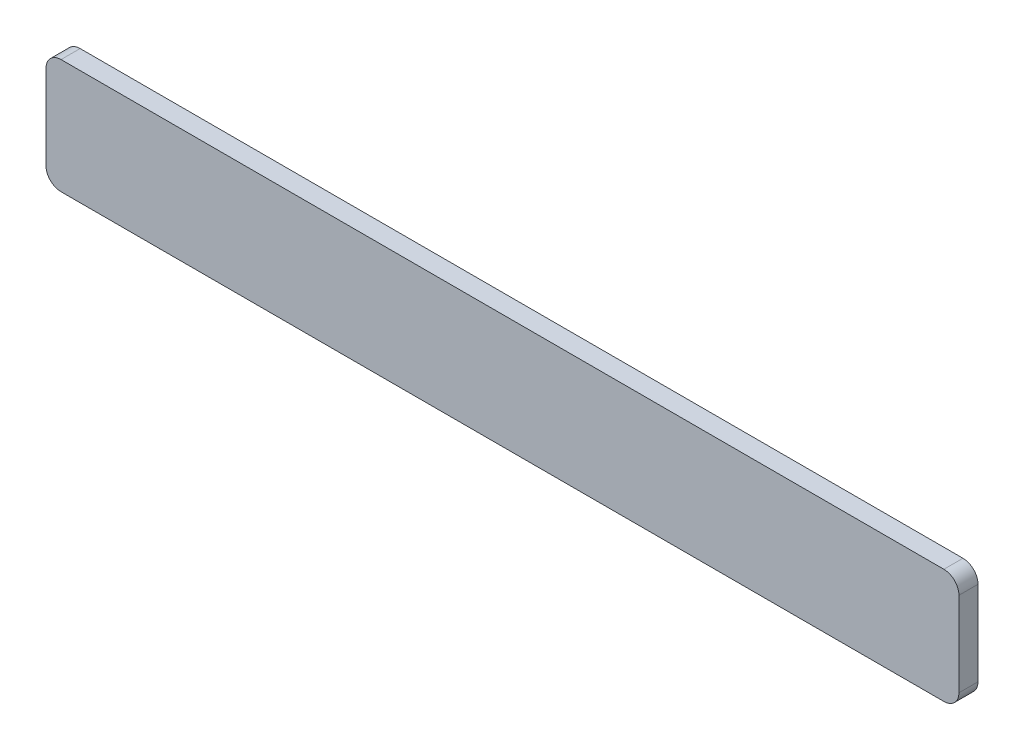
ISO-10303-21;
HEADER;
FILE_DESCRIPTION(('STEP AP214'),'2;1');
FILE_NAME('part.step','',(''),(''),'','','');
FILE_SCHEMA(('AUTOMOTIVE_DESIGN { 1 0 10303 214 1 1 1 1 }'));
ENDSEC;
DATA;
#1=APPLICATION_CONTEXT('core data for automotive mechanical design processes');
#2=APPLICATION_PROTOCOL_DEFINITION('international standard','automotive_design',2000,#1);
#3=PRODUCT_CONTEXT('',#1,'mechanical');
#4=PRODUCT('Part','Part','',(#3));
#5=PRODUCT_RELATED_PRODUCT_CATEGORY('part','',(#4));
#6=PRODUCT_DEFINITION_FORMATION('','',#4);
#7=PRODUCT_DEFINITION_CONTEXT('part definition',#1,'design');
#8=PRODUCT_DEFINITION('design','',#6,#7);
#9=PRODUCT_DEFINITION_SHAPE('','',#8);
#10=(LENGTH_UNIT() NAMED_UNIT(*) SI_UNIT(.MILLI.,.METRE.));
#11=(NAMED_UNIT(*) PLANE_ANGLE_UNIT() SI_UNIT($,.RADIAN.));
#12=(NAMED_UNIT(*) SI_UNIT($,.STERADIAN.) SOLID_ANGLE_UNIT());
#13=UNCERTAINTY_MEASURE_WITH_UNIT(LENGTH_MEASURE(1.E-05),#10,'distance_accuracy_value','');
#14=(GEOMETRIC_REPRESENTATION_CONTEXT(3) GLOBAL_UNCERTAINTY_ASSIGNED_CONTEXT((#13)) GLOBAL_UNIT_ASSIGNED_CONTEXT((#10,
#11,#12)) REPRESENTATION_CONTEXT('',''));
#15=CARTESIAN_POINT('',(0.,0.,0.));
#16=DIRECTION('',(0.,0.,1.));
#17=DIRECTION('',(1.,0.,0.));
#18=AXIS2_PLACEMENT_3D('',#15,#16,#17);
#19=CARTESIAN_POINT('',(0.,0.,12.7));
#20=DIRECTION('',(-1.,0.,0.));
#21=DIRECTION('',(0.,0.,1.));
#22=AXIS2_PLACEMENT_3D('',#19,#20,#21);
#23=PLANE('',#22);
#24=DIRECTION('',(0.,1.,0.));
#25=VECTOR('',#24,1.);
#26=CARTESIAN_POINT('',(0.,0.,12.7));
#27=LINE('',#26,#25);
#28=CARTESIAN_POINT('',(0.,10.,12.7));
#29=VERTEX_POINT('',#28);
#30=CARTESIAN_POINT('',(0.,66.2,12.7));
#31=VERTEX_POINT('',#30);
#32=EDGE_CURVE('E135',#29,#31,#27,.T.);
#33=ORIENTED_EDGE('',*,*,#32,.F.);
#34=DIRECTION('',(0.,0.,-1.));
#35=VECTOR('',#34,1.);
#36=CARTESIAN_POINT('',(0.,10.,0.));
#37=LINE('',#36,#35);
#38=CARTESIAN_POINT('',(0.,10.,0.));
#39=VERTEX_POINT('',#38);
#40=EDGE_CURVE('E178',#29,#39,#37,.T.);
#41=ORIENTED_EDGE('',*,*,#40,.T.);
#42=DIRECTION('',(0.,1.,0.));
#43=VECTOR('',#42,1.);
#44=CARTESIAN_POINT('',(0.,0.,0.));
#45=LINE('',#44,#43);
#46=CARTESIAN_POINT('',(0.,66.2,0.));
#47=VERTEX_POINT('',#46);
#48=EDGE_CURVE('E117',#39,#47,#45,.T.);
#49=ORIENTED_EDGE('',*,*,#48,.T.);
#50=DIRECTION('',(0.,0.,-1.));
#51=VECTOR('',#50,1.);
#52=CARTESIAN_POINT('',(0.,66.2,12.7));
#53=LINE('',#52,#51);
#54=EDGE_CURVE('E175',#47,#31,#53,.F.);
#55=ORIENTED_EDGE('',*,*,#54,.T.);
#56=EDGE_LOOP('',(#33,#41,#49,#55));
#57=FACE_BOUND('',#56,.T.);
#58=ADVANCED_FACE('F45',(#57),#23,.F.);
#59=CARTESIAN_POINT('',(0.,76.2,12.7));
#60=DIRECTION('',(0.,-1.,0.));
#61=DIRECTION('',(1.,0.,0.));
#62=AXIS2_PLACEMENT_3D('',#59,#60,#61);
#63=PLANE('',#62);
#64=DIRECTION('',(-1.,0.,0.));
#65=VECTOR('',#64,1.);
#66=CARTESIAN_POINT('',(0.,76.2,12.7));
#67=LINE('',#66,#65);
#68=CARTESIAN_POINT('',(-10.,76.2,12.7));
#69=VERTEX_POINT('',#68);
#70=CARTESIAN_POINT('',(-597.57,76.1999999999999,12.7));
#71=VERTEX_POINT('',#70);
#72=EDGE_CURVE('E185',#69,#71,#67,.T.);
#73=ORIENTED_EDGE('',*,*,#72,.F.);
#74=DIRECTION('',(0.,0.,-1.));
#75=VECTOR('',#74,1.);
#76=CARTESIAN_POINT('',(-10.,76.2,12.7));
#77=LINE('',#76,#75);
#78=CARTESIAN_POINT('',(-10.,76.2,0.));
#79=VERTEX_POINT('',#78);
#80=EDGE_CURVE('E11',#69,#79,#77,.T.);
#81=ORIENTED_EDGE('',*,*,#80,.T.);
#82=DIRECTION('',(-1.,0.,0.));
#83=VECTOR('',#82,1.);
#84=CARTESIAN_POINT('',(0.,76.2,0.));
#85=LINE('',#84,#83);
#86=CARTESIAN_POINT('',(-597.57,76.1999999999999,0.));
#87=VERTEX_POINT('',#86);
#88=EDGE_CURVE('E195',#79,#87,#85,.T.);
#89=ORIENTED_EDGE('',*,*,#88,.T.);
#90=DIRECTION('',(0.,0.,-1.));
#91=VECTOR('',#90,1.);
#92=CARTESIAN_POINT('',(-597.57,76.1999999999999,12.7));
#93=LINE('',#92,#91);
#94=EDGE_CURVE('E54',#87,#71,#93,.F.);
#95=ORIENTED_EDGE('',*,*,#94,.T.);
#96=EDGE_LOOP('',(#73,#81,#89,#95));
#97=FACE_BOUND('',#96,.T.);
#98=ADVANCED_FACE('F219',(#97),#63,.F.);
#99=CARTESIAN_POINT('',(-607.57,0.,12.7));
#100=DIRECTION('',(-1.,0.,0.));
#101=DIRECTION('',(0.,0.,1.));
#102=AXIS2_PLACEMENT_3D('',#99,#100,#101);
#103=PLANE('',#102);
#104=DIRECTION('',(0.,1.,0.));
#105=VECTOR('',#104,1.);
#106=CARTESIAN_POINT('',(-607.57,0.,0.));
#107=LINE('',#106,#105);
#108=CARTESIAN_POINT('',(-607.57,10.,0.));
#109=VERTEX_POINT('',#108);
#110=CARTESIAN_POINT('',(-607.57,66.2,0.));
#111=VERTEX_POINT('',#110);
#112=EDGE_CURVE('E136',#109,#111,#107,.T.);
#113=ORIENTED_EDGE('',*,*,#112,.F.);
#114=DIRECTION('',(0.,0.,-1.));
#115=VECTOR('',#114,1.);
#116=CARTESIAN_POINT('',(-607.57,10.,12.7));
#117=LINE('',#116,#115);
#118=CARTESIAN_POINT('',(-607.57,10.,12.7));
#119=VERTEX_POINT('',#118);
#120=EDGE_CURVE('E162',#109,#119,#117,.F.);
#121=ORIENTED_EDGE('',*,*,#120,.T.);
#122=DIRECTION('',(0.,1.,0.));
#123=VECTOR('',#122,1.);
#124=CARTESIAN_POINT('',(-607.57,0.,12.7));
#125=LINE('',#124,#123);
#126=CARTESIAN_POINT('',(-607.57,66.2,12.7));
#127=VERTEX_POINT('',#126);
#128=EDGE_CURVE('E148',#119,#127,#125,.T.);
#129=ORIENTED_EDGE('',*,*,#128,.T.);
#130=DIRECTION('',(0.,0.,-1.));
#131=VECTOR('',#130,1.);
#132=CARTESIAN_POINT('',(-607.57,66.2,0.));
#133=LINE('',#132,#131);
#134=EDGE_CURVE('E158',#127,#111,#133,.T.);
#135=ORIENTED_EDGE('',*,*,#134,.T.);
#136=EDGE_LOOP('',(#113,#121,#129,#135));
#137=FACE_BOUND('',#136,.T.);
#138=ADVANCED_FACE('F203',(#137),#103,.T.);
#139=CARTESIAN_POINT('',(0.,0.,12.7));
#140=DIRECTION('',(0.,-1.,0.));
#141=DIRECTION('',(0.,0.,-1.));
#142=AXIS2_PLACEMENT_3D('',#139,#140,#141);
#143=PLANE('',#142);
#144=DIRECTION('',(-1.,0.,0.));
#145=VECTOR('',#144,1.);
#146=CARTESIAN_POINT('',(0.,0.,12.7));
#147=LINE('',#146,#145);
#148=CARTESIAN_POINT('',(-10.,0.,12.7));
#149=VERTEX_POINT('',#148);
#150=CARTESIAN_POINT('',(-597.57,0.,12.7));
#151=VERTEX_POINT('',#150);
#152=EDGE_CURVE('E142',#149,#151,#147,.T.);
#153=ORIENTED_EDGE('',*,*,#152,.T.);
#154=DIRECTION('',(0.,0.,-1.));
#155=VECTOR('',#154,1.);
#156=CARTESIAN_POINT('',(-597.57,0.,12.7));
#157=LINE('',#156,#155);
#158=CARTESIAN_POINT('',(-597.57,0.,0.));
#159=VERTEX_POINT('',#158);
#160=EDGE_CURVE('E133',#151,#159,#157,.T.);
#161=ORIENTED_EDGE('',*,*,#160,.T.);
#162=DIRECTION('',(-1.,0.,0.));
#163=VECTOR('',#162,1.);
#164=CARTESIAN_POINT('',(0.,0.,0.));
#165=LINE('',#164,#163);
#166=CARTESIAN_POINT('',(-10.,0.,0.));
#167=VERTEX_POINT('',#166);
#168=EDGE_CURVE('E115',#167,#159,#165,.T.);
#169=ORIENTED_EDGE('',*,*,#168,.F.);
#170=DIRECTION('',(0.,0.,-1.));
#171=VECTOR('',#170,1.);
#172=CARTESIAN_POINT('',(-10.,0.,12.7));
#173=LINE('',#172,#171);
#174=EDGE_CURVE('E130',#167,#149,#173,.F.);
#175=ORIENTED_EDGE('',*,*,#174,.T.);
#176=EDGE_LOOP('',(#153,#161,#169,#175));
#177=FACE_BOUND('',#176,.T.);
#178=ADVANCED_FACE('F129',(#177),#143,.T.);
#179=CARTESIAN_POINT('',(0.,0.,12.7));
#180=DIRECTION('',(0.,0.,1.));
#181=DIRECTION('',(1.,0.,0.));
#182=AXIS2_PLACEMENT_3D('',#179,#180,#181);
#183=PLANE('',#182);
#184=ORIENTED_EDGE('',*,*,#128,.F.);
#185=CARTESIAN_POINT('',(-597.57,10.,12.7));
#186=DIRECTION('',(0.,0.,1.));
#187=DIRECTION('',(1.,0.,0.));
#188=AXIS2_PLACEMENT_3D('',#185,#186,#187);
#189=CIRCLE('',#188,10.);
#190=EDGE_CURVE('E172',#119,#151,#189,.T.);
#191=ORIENTED_EDGE('',*,*,#190,.T.);
#192=ORIENTED_EDGE('',*,*,#152,.F.);
#193=CARTESIAN_POINT('',(-10.,10.,12.7));
#194=DIRECTION('',(0.,0.,1.));
#195=DIRECTION('',(1.,0.,0.));
#196=AXIS2_PLACEMENT_3D('',#193,#194,#195);
#197=CIRCLE('',#196,10.);
#198=EDGE_CURVE('E140',#149,#29,#197,.T.);
#199=ORIENTED_EDGE('',*,*,#198,.T.);
#200=ORIENTED_EDGE('',*,*,#32,.T.);
#201=CARTESIAN_POINT('',(-10.,66.2,12.7));
#202=DIRECTION('',(0.,0.,1.));
#203=DIRECTION('',(1.,0.,0.));
#204=AXIS2_PLACEMENT_3D('',#201,#202,#203);
#205=CIRCLE('',#204,10.);
#206=EDGE_CURVE('E67',#31,#69,#205,.T.);
#207=ORIENTED_EDGE('',*,*,#206,.T.);
#208=ORIENTED_EDGE('',*,*,#72,.T.);
#209=CARTESIAN_POINT('',(-597.57,66.2,12.7));
#210=DIRECTION('',(0.,0.,1.));
#211=DIRECTION('',(1.,0.,0.));
#212=AXIS2_PLACEMENT_3D('',#209,#210,#211);
#213=CIRCLE('',#212,10.);
#214=EDGE_CURVE('E165',#71,#127,#213,.T.);
#215=ORIENTED_EDGE('',*,*,#214,.T.);
#216=EDGE_LOOP('',(#184,#191,#192,#199,#200,#207,#208,#215));
#217=FACE_BOUND('',#216,.T.);
#218=ADVANCED_FACE('F209',(#217),#183,.T.);
#219=CARTESIAN_POINT('',(0.,0.,0.));
#220=DIRECTION('',(0.,0.,1.));
#221=DIRECTION('',(1.,0.,0.));
#222=AXIS2_PLACEMENT_3D('',#219,#220,#221);
#223=PLANE('',#222);
#224=ORIENTED_EDGE('',*,*,#168,.T.);
#225=CARTESIAN_POINT('',(-597.57,10.,0.));
#226=DIRECTION('',(0.,0.,1.));
#227=DIRECTION('',(1.,0.,0.));
#228=AXIS2_PLACEMENT_3D('',#225,#226,#227);
#229=CIRCLE('',#228,10.);
#230=EDGE_CURVE('E123',#159,#109,#229,.F.);
#231=ORIENTED_EDGE('',*,*,#230,.T.);
#232=ORIENTED_EDGE('',*,*,#112,.T.);
#233=CARTESIAN_POINT('',(-597.57,66.2,0.));
#234=DIRECTION('',(0.,0.,1.));
#235=DIRECTION('',(1.,0.,0.));
#236=AXIS2_PLACEMENT_3D('',#233,#234,#235);
#237=CIRCLE('',#236,10.);
#238=EDGE_CURVE('E146',#111,#87,#237,.F.);
#239=ORIENTED_EDGE('',*,*,#238,.T.);
#240=ORIENTED_EDGE('',*,*,#88,.F.);
#241=CARTESIAN_POINT('',(-10.,66.2,0.));
#242=DIRECTION('',(0.,0.,1.));
#243=DIRECTION('',(1.,0.,0.));
#244=AXIS2_PLACEMENT_3D('',#241,#242,#243);
#245=CIRCLE('',#244,10.);
#246=EDGE_CURVE('E124',#79,#47,#245,.F.);
#247=ORIENTED_EDGE('',*,*,#246,.T.);
#248=ORIENTED_EDGE('',*,*,#48,.F.);
#249=CARTESIAN_POINT('',(-10.,10.,0.));
#250=DIRECTION('',(0.,0.,1.));
#251=DIRECTION('',(1.,0.,0.));
#252=AXIS2_PLACEMENT_3D('',#249,#250,#251);
#253=CIRCLE('',#252,10.);
#254=EDGE_CURVE('E112',#39,#167,#253,.F.);
#255=ORIENTED_EDGE('',*,*,#254,.T.);
#256=EDGE_LOOP('',(#224,#231,#232,#239,#240,#247,#248,#255));
#257=FACE_BOUND('',#256,.T.);
#258=ADVANCED_FACE('F114',(#257),#223,.F.);
#259=CARTESIAN_POINT('',(-597.57,10.,12.7));
#260=DIRECTION('',(0.,0.,-1.));
#261=DIRECTION('',(-1.,0.,0.));
#262=AXIS2_PLACEMENT_3D('',#259,#260,#261);
#263=CYLINDRICAL_SURFACE('',#262,10.);
#264=ORIENTED_EDGE('',*,*,#190,.F.);
#265=ORIENTED_EDGE('',*,*,#120,.F.);
#266=ORIENTED_EDGE('',*,*,#230,.F.);
#267=ORIENTED_EDGE('',*,*,#160,.F.);
#268=EDGE_LOOP('',(#264,#265,#266,#267));
#269=FACE_BOUND('',#268,.T.);
#270=ADVANCED_FACE('F208',(#269),#263,.T.);
#271=CARTESIAN_POINT('',(-10.,10.,12.7));
#272=DIRECTION('',(0.,0.,1.));
#273=DIRECTION('',(1.,0.,0.));
#274=AXIS2_PLACEMENT_3D('',#271,#272,#273);
#275=CYLINDRICAL_SURFACE('',#274,10.);
#276=ORIENTED_EDGE('',*,*,#198,.F.);
#277=ORIENTED_EDGE('',*,*,#174,.F.);
#278=ORIENTED_EDGE('',*,*,#254,.F.);
#279=ORIENTED_EDGE('',*,*,#40,.F.);
#280=EDGE_LOOP('',(#276,#277,#278,#279));
#281=FACE_BOUND('',#280,.T.);
#282=ADVANCED_FACE('F139',(#281),#275,.T.);
#283=CARTESIAN_POINT('',(-10.,66.2,12.7));
#284=DIRECTION('',(0.,0.,-1.));
#285=DIRECTION('',(-1.,0.,0.));
#286=AXIS2_PLACEMENT_3D('',#283,#284,#285);
#287=CYLINDRICAL_SURFACE('',#286,10.);
#288=ORIENTED_EDGE('',*,*,#206,.F.);
#289=ORIENTED_EDGE('',*,*,#54,.F.);
#290=ORIENTED_EDGE('',*,*,#246,.F.);
#291=ORIENTED_EDGE('',*,*,#80,.F.);
#292=EDGE_LOOP('',(#288,#289,#290,#291));
#293=FACE_BOUND('',#292,.T.);
#294=ADVANCED_FACE('F213',(#293),#287,.T.);
#295=CARTESIAN_POINT('',(-597.57,66.2,12.7));
#296=DIRECTION('',(0.,0.,1.));
#297=DIRECTION('',(1.,0.,0.));
#298=AXIS2_PLACEMENT_3D('',#295,#296,#297);
#299=CYLINDRICAL_SURFACE('',#298,10.);
#300=ORIENTED_EDGE('',*,*,#214,.F.);
#301=ORIENTED_EDGE('',*,*,#94,.F.);
#302=ORIENTED_EDGE('',*,*,#238,.F.);
#303=ORIENTED_EDGE('',*,*,#134,.F.);
#304=EDGE_LOOP('',(#300,#301,#302,#303));
#305=FACE_BOUND('',#304,.T.);
#306=ADVANCED_FACE('F47',(#305),#299,.T.);
#307=CLOSED_SHELL('',(#58,#98,#138,#178,#218,#258,#270,#282,#294,#306));
#308=MANIFOLD_SOLID_BREP('B2',#307);
#309=ADVANCED_BREP_SHAPE_REPRESENTATION('',(#18,#308),#14);
#310=SHAPE_DEFINITION_REPRESENTATION(#9,#309);
ENDSEC;
END-ISO-10303-21;
